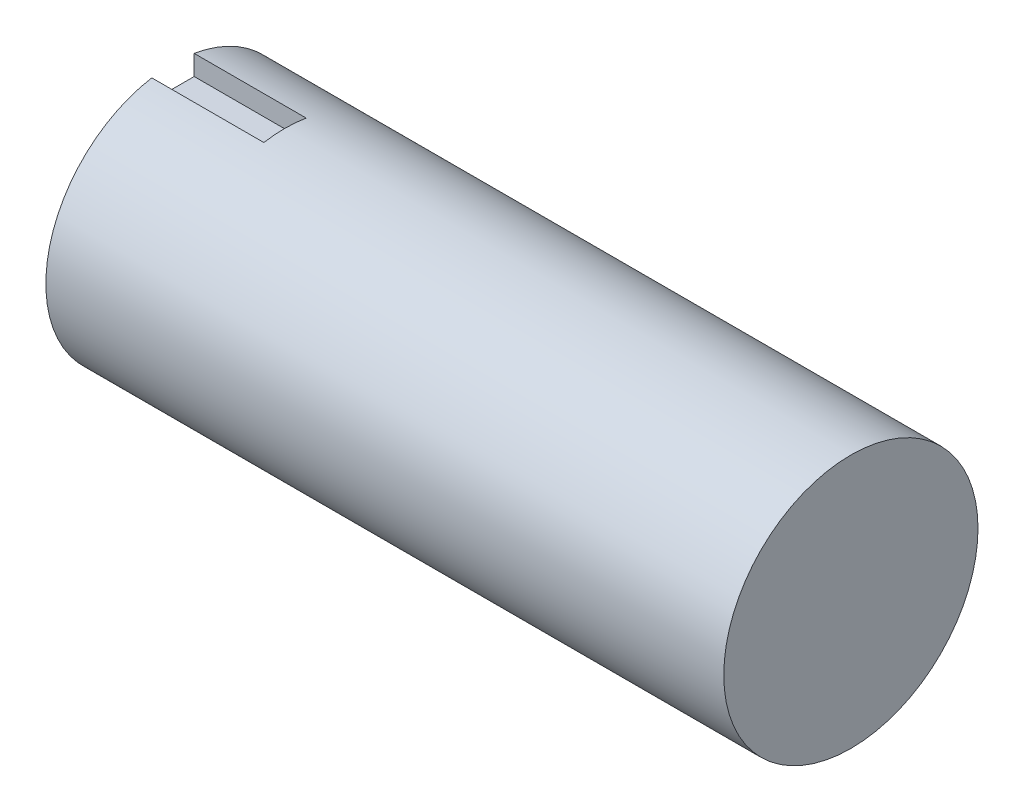
ISO-10303-21;
HEADER;
FILE_DESCRIPTION(('STEP AP214'),'2;1');
FILE_NAME('part.step','',(''),(''),'','','');
FILE_SCHEMA(('AUTOMOTIVE_DESIGN { 1 0 10303 214 1 1 1 1 }'));
ENDSEC;
DATA;
#1=APPLICATION_CONTEXT('core data for automotive mechanical design processes');
#2=APPLICATION_PROTOCOL_DEFINITION('international standard','automotive_design',2000,#1);
#3=PRODUCT_CONTEXT('',#1,'mechanical');
#4=PRODUCT('Part','Part','',(#3));
#5=PRODUCT_RELATED_PRODUCT_CATEGORY('part','',(#4));
#6=PRODUCT_DEFINITION_FORMATION('','',#4);
#7=PRODUCT_DEFINITION_CONTEXT('part definition',#1,'design');
#8=PRODUCT_DEFINITION('design','',#6,#7);
#9=PRODUCT_DEFINITION_SHAPE('','',#8);
#10=(LENGTH_UNIT() NAMED_UNIT(*) SI_UNIT(.MILLI.,.METRE.));
#11=(NAMED_UNIT(*) PLANE_ANGLE_UNIT() SI_UNIT($,.RADIAN.));
#12=(NAMED_UNIT(*) SI_UNIT($,.STERADIAN.) SOLID_ANGLE_UNIT());
#13=UNCERTAINTY_MEASURE_WITH_UNIT(LENGTH_MEASURE(1.E-05),#10,'distance_accuracy_value','');
#14=(GEOMETRIC_REPRESENTATION_CONTEXT(3) GLOBAL_UNCERTAINTY_ASSIGNED_CONTEXT((#13)) GLOBAL_UNIT_ASSIGNED_CONTEXT((#10,
#11,#12)) REPRESENTATION_CONTEXT('',''));
#15=CARTESIAN_POINT('',(0.,0.,0.));
#16=DIRECTION('',(0.,0.,1.));
#17=DIRECTION('',(1.,0.,0.));
#18=AXIS2_PLACEMENT_3D('',#15,#16,#17);
#19=CARTESIAN_POINT('',(-178.786712873208,0.,1.80477854883065E-13));
#20=DIRECTION('',(1.,0.,0.));
#21=DIRECTION('',(0.,0.,-1.));
#22=AXIS2_PLACEMENT_3D('',#19,#20,#21);
#23=PLANE('',#22);
#24=CARTESIAN_POINT('',(-178.786712873208,0.,1.80477854883065E-13));
#25=DIRECTION('',(1.,0.,0.));
#26=DIRECTION('',(0.,0.,-1.));
#27=AXIS2_PLACEMENT_3D('',#24,#25,#26);
#28=CIRCLE('',#27,19.05);
#29=CARTESIAN_POINT('',(-178.786712873208,18.7835533113413,-3.17499999999972));
#30=VERTEX_POINT('',#29);
#31=CARTESIAN_POINT('',(-178.786712873208,18.7835533113413,3.17500000000017));
#32=VERTEX_POINT('',#31);
#33=EDGE_CURVE('E20',#30,#32,#28,.T.);
#34=ORIENTED_EDGE('',*,*,#33,.F.);
#35=DIRECTION('',(0.,-1.,0.));
#36=VECTOR('',#35,1.);
#37=CARTESIAN_POINT('',(-178.786712873208,15.7797456878692,-3.17499999999982));
#38=LINE('',#37,#36);
#39=CARTESIAN_POINT('',(-178.786712873208,15.7797456878692,-3.17499999999982));
#40=VERTEX_POINT('',#39);
#41=EDGE_CURVE('E48',#40,#30,#38,.F.);
#42=ORIENTED_EDGE('',*,*,#41,.F.);
#43=DIRECTION('',(0.,0.,1.));
#44=VECTOR('',#43,1.);
#45=CARTESIAN_POINT('',(-178.786712873208,15.7797456878692,3.17500000000018));
#46=LINE('',#45,#44);
#47=CARTESIAN_POINT('',(-178.786712873208,15.7797456878692,3.17500000000017));
#48=VERTEX_POINT('',#47);
#49=EDGE_CURVE('E56',#48,#40,#46,.F.);
#50=ORIENTED_EDGE('',*,*,#49,.F.);
#51=DIRECTION('',(0.,1.,0.));
#52=VECTOR('',#51,1.);
#53=CARTESIAN_POINT('',(-178.786712873208,18.7835533113415,3.17500000000017));
#54=LINE('',#53,#52);
#55=EDGE_CURVE('E88',#32,#48,#54,.F.);
#56=ORIENTED_EDGE('',*,*,#55,.F.);
#57=EDGE_LOOP('',(#34,#42,#50,#56));
#58=FACE_BOUND('',#57,.T.);
#59=ADVANCED_FACE('F17',(#58),#23,.F.);
#60=CARTESIAN_POINT('',(-195.581722381551,15.7797456878692,-3.17499999999982));
#61=DIRECTION('',(0.,0.,1.));
#62=DIRECTION('',(0.,-1.,0.));
#63=AXIS2_PLACEMENT_3D('',#60,#61,#62);
#64=PLANE('',#63);
#65=DIRECTION('',(0.,1.,0.));
#66=VECTOR('',#65,1.);
#67=CARTESIAN_POINT('',(-195.581722381551,2.31403218030893,-3.17499999999973));
#68=LINE('',#67,#66);
#69=CARTESIAN_POINT('',(-195.581722381552,18.7835533113413,-3.17499999999969));
#70=VERTEX_POINT('',#69);
#71=CARTESIAN_POINT('',(-195.581722381551,15.7797456878692,-3.17499999999976));
#72=VERTEX_POINT('',#71);
#73=EDGE_CURVE('E60',#70,#72,#68,.F.);
#74=ORIENTED_EDGE('',*,*,#73,.T.);
#75=DIRECTION('',(1.,0.,0.));
#76=VECTOR('',#75,1.);
#77=CARTESIAN_POINT('',(-195.581722381551,15.7797456878692,-3.17499999999982));
#78=LINE('',#77,#76);
#79=EDGE_CURVE('E93',#40,#72,#78,.F.);
#80=ORIENTED_EDGE('',*,*,#79,.F.);
#81=ORIENTED_EDGE('',*,*,#41,.T.);
#82=DIRECTION('',(1.,0.,0.));
#83=VECTOR('',#82,1.);
#84=CARTESIAN_POINT('',(-178.786712873208,18.7835533113413,-3.17499999999969));
#85=LINE('',#84,#83);
#86=EDGE_CURVE('E67',#70,#30,#85,.T.);
#87=ORIENTED_EDGE('',*,*,#86,.F.);
#88=EDGE_LOOP('',(#74,#80,#81,#87));
#89=FACE_BOUND('',#88,.T.);
#90=ADVANCED_FACE('F70',(#89),#64,.T.);
#91=CARTESIAN_POINT('',(-195.581722381551,15.7797456878692,3.17500000000018));
#92=DIRECTION('',(0.,1.,0.));
#93=DIRECTION('',(0.,0.,1.));
#94=AXIS2_PLACEMENT_3D('',#91,#92,#93);
#95=PLANE('',#94);
#96=DIRECTION('',(0.,0.,1.));
#97=VECTOR('',#96,1.);
#98=CARTESIAN_POINT('',(-195.581722381551,15.7797456878692,1.80477854883065E-13));
#99=LINE('',#98,#97);
#100=CARTESIAN_POINT('',(-195.581722381551,15.7797456878692,3.17500000000018));
#101=VERTEX_POINT('',#100);
#102=EDGE_CURVE('E75',#72,#101,#99,.T.);
#103=ORIENTED_EDGE('',*,*,#102,.T.);
#104=DIRECTION('',(-1.,0.,0.));
#105=VECTOR('',#104,1.);
#106=CARTESIAN_POINT('',(-195.581722381552,15.7797456878692,3.17500000000018));
#107=LINE('',#106,#105);
#108=EDGE_CURVE('E71',#48,#101,#107,.T.);
#109=ORIENTED_EDGE('',*,*,#108,.F.);
#110=ORIENTED_EDGE('',*,*,#49,.T.);
#111=ORIENTED_EDGE('',*,*,#79,.T.);
#112=EDGE_LOOP('',(#103,#109,#110,#111));
#113=FACE_BOUND('',#112,.T.);
#114=ADVANCED_FACE('F112',(#113),#95,.T.);
#115=CARTESIAN_POINT('',(-195.581722381552,18.7835533113415,3.17500000000018));
#116=DIRECTION('',(0.,0.,-1.));
#117=DIRECTION('',(-1.,0.,0.));
#118=AXIS2_PLACEMENT_3D('',#115,#116,#117);
#119=PLANE('',#118);
#120=DIRECTION('',(0.,1.,0.));
#121=VECTOR('',#120,1.);
#122=CARTESIAN_POINT('',(-195.581722381551,2.31403218030893,3.17500000000018));
#123=LINE('',#122,#121);
#124=CARTESIAN_POINT('',(-195.581722381551,18.7835533113413,3.17500000000019));
#125=VERTEX_POINT('',#124);
#126=EDGE_CURVE('E77',#101,#125,#123,.T.);
#127=ORIENTED_EDGE('',*,*,#126,.T.);
#128=DIRECTION('',(1.,0.,0.));
#129=VECTOR('',#128,1.);
#130=CARTESIAN_POINT('',(-178.786712873208,18.7835533113413,3.17500000000018));
#131=LINE('',#130,#129);
#132=EDGE_CURVE('E69',#32,#125,#131,.F.);
#133=ORIENTED_EDGE('',*,*,#132,.F.);
#134=ORIENTED_EDGE('',*,*,#55,.T.);
#135=ORIENTED_EDGE('',*,*,#108,.T.);
#136=EDGE_LOOP('',(#127,#133,#134,#135));
#137=FACE_BOUND('',#136,.T.);
#138=ADVANCED_FACE('F110',(#137),#119,.T.);
#139=CARTESIAN_POINT('',(-93.9817223815516,0.,0.));
#140=DIRECTION('',(1.,0.,0.));
#141=DIRECTION('',(0.,0.,-1.));
#142=AXIS2_PLACEMENT_3D('',#139,#140,#141);
#143=PLANE('',#142);
#144=CARTESIAN_POINT('',(-93.9817223815515,0.,1.23986383054893E-13));
#145=DIRECTION('',(1.,0.,0.));
#146=DIRECTION('',(0.,0.,-1.));
#147=AXIS2_PLACEMENT_3D('',#144,#145,#146);
#148=CIRCLE('',#147,19.05);
#149=CARTESIAN_POINT('',(-93.9817223815516,0.,-19.0499999999999));
#150=VERTEX_POINT('',#149);
#151=EDGE_CURVE('E26',#150,#150,#148,.F.);
#152=ORIENTED_EDGE('',*,*,#151,.F.);
#153=EDGE_LOOP('',(#152));
#154=FACE_BOUND('',#153,.T.);
#155=ADVANCED_FACE('F120',(#154),#143,.T.);
#156=CARTESIAN_POINT('',(-195.581722381551,2.31403218030893,1.80477854883065E-13));
#157=DIRECTION('',(1.,0.,0.));
#158=DIRECTION('',(0.,1.,0.));
#159=AXIS2_PLACEMENT_3D('',#156,#157,#158);
#160=PLANE('',#159);
#161=CARTESIAN_POINT('',(-195.581722381552,0.,1.91665578636042E-13));
#162=DIRECTION('',(1.,0.,0.));
#163=DIRECTION('',(0.,0.,-1.));
#164=AXIS2_PLACEMENT_3D('',#161,#162,#163);
#165=CIRCLE('',#164,19.05);
#166=EDGE_CURVE('E11',#125,#70,#165,.T.);
#167=ORIENTED_EDGE('',*,*,#166,.F.);
#168=ORIENTED_EDGE('',*,*,#126,.F.);
#169=ORIENTED_EDGE('',*,*,#102,.F.);
#170=ORIENTED_EDGE('',*,*,#73,.F.);
#171=EDGE_LOOP('',(#167,#168,#169,#170));
#172=FACE_BOUND('',#171,.T.);
#173=ADVANCED_FACE('F74',(#172),#160,.F.);
#174=CARTESIAN_POINT('',(-178.786712873208,0.,1.80477854883065E-13));
#175=DIRECTION('',(1.,0.,0.));
#176=DIRECTION('',(0.,0.,-1.));
#177=AXIS2_PLACEMENT_3D('',#174,#175,#176);
#178=CYLINDRICAL_SURFACE('',#177,19.05);
#179=ORIENTED_EDGE('',*,*,#151,.T.);
#180=EDGE_LOOP('',(#179));
#181=FACE_BOUND('',#180,.T.);
#182=ORIENTED_EDGE('',*,*,#166,.T.);
#183=ORIENTED_EDGE('',*,*,#86,.T.);
#184=ORIENTED_EDGE('',*,*,#33,.T.);
#185=ORIENTED_EDGE('',*,*,#132,.T.);
#186=EDGE_LOOP('',(#182,#183,#184,#185));
#187=FACE_BOUND('',#186,.T.);
#188=ADVANCED_FACE('F65',(#181,#187),#178,.T.);
#189=CLOSED_SHELL('',(#59,#90,#114,#138,#155,#173,#188));
#190=MANIFOLD_SOLID_BREP('B1',#189);
#191=ADVANCED_BREP_SHAPE_REPRESENTATION('',(#18,#190),#14);
#192=SHAPE_DEFINITION_REPRESENTATION(#9,#191);
ENDSEC;
END-ISO-10303-21;
